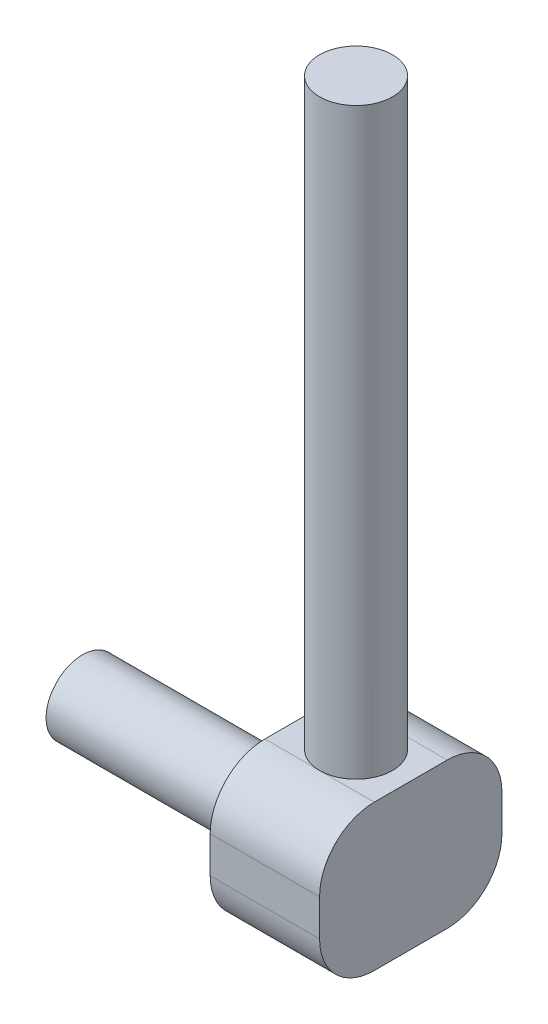
ISO-10303-21;
HEADER;
FILE_DESCRIPTION(('STEP AP214'),'2;1');
FILE_NAME('part.step','',(''),(''),'','','');
FILE_SCHEMA(('AUTOMOTIVE_DESIGN { 1 0 10303 214 1 1 1 1 }'));
ENDSEC;
DATA;
#1=APPLICATION_CONTEXT('core data for automotive mechanical design processes');
#2=APPLICATION_PROTOCOL_DEFINITION('international standard','automotive_design',2000,#1);
#3=PRODUCT_CONTEXT('',#1,'mechanical');
#4=PRODUCT('Part','Part','',(#3));
#5=PRODUCT_RELATED_PRODUCT_CATEGORY('part','',(#4));
#6=PRODUCT_DEFINITION_FORMATION('','',#4);
#7=PRODUCT_DEFINITION_CONTEXT('part definition',#1,'design');
#8=PRODUCT_DEFINITION('design','',#6,#7);
#9=PRODUCT_DEFINITION_SHAPE('','',#8);
#10=(LENGTH_UNIT() NAMED_UNIT(*) SI_UNIT(.MILLI.,.METRE.));
#11=(NAMED_UNIT(*) PLANE_ANGLE_UNIT() SI_UNIT($,.RADIAN.));
#12=(NAMED_UNIT(*) SI_UNIT($,.STERADIAN.) SOLID_ANGLE_UNIT());
#13=UNCERTAINTY_MEASURE_WITH_UNIT(LENGTH_MEASURE(1.E-05),#10,'distance_accuracy_value','');
#14=(GEOMETRIC_REPRESENTATION_CONTEXT(3) GLOBAL_UNCERTAINTY_ASSIGNED_CONTEXT((#13)) GLOBAL_UNIT_ASSIGNED_CONTEXT((#10,
#11,#12)) REPRESENTATION_CONTEXT('',''));
#15=CARTESIAN_POINT('',(0.,0.,0.));
#16=DIRECTION('',(0.,0.,1.));
#17=DIRECTION('',(1.,0.,0.));
#18=AXIS2_PLACEMENT_3D('',#15,#16,#17);
#19=CARTESIAN_POINT('',(0.,200.,0.));
#20=DIRECTION('',(0.,-1.,0.));
#21=DIRECTION('',(0.,0.,-1.));
#22=AXIS2_PLACEMENT_3D('',#19,#20,#21);
#23=CYLINDRICAL_SURFACE('',#22,10.);
#24=CARTESIAN_POINT('',(0.,40.,0.));
#25=DIRECTION('',(0.,1.,0.));
#26=DIRECTION('',(0.,0.,1.));
#27=AXIS2_PLACEMENT_3D('',#24,#25,#26);
#28=CIRCLE('',#27,10.);
#29=CARTESIAN_POINT('',(0.,40.,-10.));
#30=VERTEX_POINT('',#29);
#31=CARTESIAN_POINT('',(0.,40.,10.));
#32=VERTEX_POINT('',#31);
#33=EDGE_CURVE('E38',#30,#32,#28,.T.);
#34=ORIENTED_EDGE('',*,*,#33,.T.);
#35=EDGE_CURVE('E43',#32,#30,#28,.T.);
#36=ORIENTED_EDGE('',*,*,#35,.T.);
#37=EDGE_LOOP('',(#34,#36));
#38=FACE_BOUND('',#37,.T.);
#39=CARTESIAN_POINT('',(0.,200.,0.));
#40=DIRECTION('',(0.,1.,0.));
#41=DIRECTION('',(0.,0.,1.));
#42=AXIS2_PLACEMENT_3D('',#39,#40,#41);
#43=CIRCLE('',#42,10.);
#44=CARTESIAN_POINT('',(0.,200.,10.));
#45=VERTEX_POINT('',#44);
#46=EDGE_CURVE('E170',#45,#45,#43,.T.);
#47=ORIENTED_EDGE('',*,*,#46,.F.);
#48=EDGE_LOOP('',(#47));
#49=FACE_BOUND('',#48,.T.);
#50=ADVANCED_FACE('F35',(#38,#49),#23,.T.);
#51=CARTESIAN_POINT('',(0.,200.,0.));
#52=DIRECTION('',(0.,1.,0.));
#53=DIRECTION('',(0.,0.,1.));
#54=AXIS2_PLACEMENT_3D('',#51,#52,#53);
#55=PLANE('',#54);
#56=ORIENTED_EDGE('',*,*,#46,.T.);
#57=EDGE_LOOP('',(#56));
#58=FACE_BOUND('',#57,.T.);
#59=ADVANCED_FACE('F227',(#58),#55,.T.);
#60=CARTESIAN_POINT('',(-15.,40.,10.));
#61=DIRECTION('',(0.,1.,0.));
#62=DIRECTION('',(0.,0.,1.));
#63=AXIS2_PLACEMENT_3D('',#60,#61,#62);
#64=PLANE('',#63);
#65=ORIENTED_EDGE('',*,*,#35,.F.);
#66=DIRECTION('',(1.,0.,0.));
#67=VECTOR('',#66,1.);
#68=CARTESIAN_POINT('',(-15.,40.,10.));
#69=LINE('',#68,#67);
#70=CARTESIAN_POINT('',(15.,40.,10.));
#71=VERTEX_POINT('',#70);
#72=EDGE_CURVE('E178',#32,#71,#69,.T.);
#73=ORIENTED_EDGE('',*,*,#72,.T.);
#74=DIRECTION('',(0.,0.,1.));
#75=VECTOR('',#74,1.);
#76=CARTESIAN_POINT('',(15.,40.,10.));
#77=LINE('',#76,#75);
#78=CARTESIAN_POINT('',(15.,40.,-10.));
#79=VERTEX_POINT('',#78);
#80=EDGE_CURVE('E137',#79,#71,#77,.T.);
#81=ORIENTED_EDGE('',*,*,#80,.F.);
#82=DIRECTION('',(1.,0.,0.));
#83=VECTOR('',#82,1.);
#84=CARTESIAN_POINT('',(-15.,40.,-10.));
#85=LINE('',#84,#83);
#86=EDGE_CURVE('E182',#30,#79,#85,.T.);
#87=ORIENTED_EDGE('',*,*,#86,.F.);
#88=EDGE_LOOP('',(#65,#73,#81,#87));
#89=FACE_BOUND('',#88,.T.);
#90=ADVANCED_FACE('F191',(#89),#64,.T.);
#91=CARTESIAN_POINT('',(-15.,15.,-10.));
#92=DIRECTION('',(1.,0.,0.));
#93=DIRECTION('',(0.,0.,-1.));
#94=AXIS2_PLACEMENT_3D('',#91,#92,#93);
#95=CYLINDRICAL_SURFACE('',#94,15.);
#96=DIRECTION('',(1.,0.,0.));
#97=VECTOR('',#96,1.);
#98=CARTESIAN_POINT('',(-15.,15.0000000000001,-25.));
#99=LINE('',#98,#97);
#100=CARTESIAN_POINT('',(-15.,15.0000000000001,-25.));
#101=VERTEX_POINT('',#100);
#102=CARTESIAN_POINT('',(15.,15.0000000000001,-25.));
#103=VERTEX_POINT('',#102);
#104=EDGE_CURVE('E105',#101,#103,#99,.T.);
#105=ORIENTED_EDGE('',*,*,#104,.T.);
#106=CARTESIAN_POINT('',(15.,15.,-10.));
#107=DIRECTION('',(1.,0.,0.));
#108=DIRECTION('',(0.,0.,-1.));
#109=AXIS2_PLACEMENT_3D('',#106,#107,#108);
#110=CIRCLE('',#109,15.);
#111=CARTESIAN_POINT('',(15.,0.,-9.9999999999999));
#112=VERTEX_POINT('',#111);
#113=EDGE_CURVE('E109',#112,#103,#110,.T.);
#114=ORIENTED_EDGE('',*,*,#113,.F.);
#115=DIRECTION('',(1.,0.,0.));
#116=VECTOR('',#115,1.);
#117=CARTESIAN_POINT('',(-15.,0.,-9.9999999999999));
#118=LINE('',#117,#116);
#119=CARTESIAN_POINT('',(-15.,0.,-9.9999999999999));
#120=VERTEX_POINT('',#119);
#121=EDGE_CURVE('E168',#120,#112,#118,.T.);
#122=ORIENTED_EDGE('',*,*,#121,.F.);
#123=CARTESIAN_POINT('',(-15.,15.,-10.));
#124=DIRECTION('',(1.,0.,0.));
#125=DIRECTION('',(0.,0.,-1.));
#126=AXIS2_PLACEMENT_3D('',#123,#124,#125);
#127=CIRCLE('',#126,15.);
#128=EDGE_CURVE('E111',#120,#101,#127,.T.);
#129=ORIENTED_EDGE('',*,*,#128,.T.);
#130=EDGE_LOOP('',(#105,#114,#122,#129));
#131=FACE_BOUND('',#130,.T.);
#132=ADVANCED_FACE('F107',(#131),#95,.T.);
#133=CARTESIAN_POINT('',(-15.,15.,10.));
#134=DIRECTION('',(1.,0.,0.));
#135=DIRECTION('',(0.,0.,-1.));
#136=AXIS2_PLACEMENT_3D('',#133,#134,#135);
#137=CYLINDRICAL_SURFACE('',#136,15.);
#138=DIRECTION('',(1.,0.,0.));
#139=VECTOR('',#138,1.);
#140=CARTESIAN_POINT('',(-15.,0.,9.9999999999999));
#141=LINE('',#140,#139);
#142=CARTESIAN_POINT('',(-15.,0.,9.9999999999999));
#143=VERTEX_POINT('',#142);
#144=CARTESIAN_POINT('',(15.,0.,9.9999999999999));
#145=VERTEX_POINT('',#144);
#146=EDGE_CURVE('E171',#143,#145,#141,.T.);
#147=ORIENTED_EDGE('',*,*,#146,.T.);
#148=CARTESIAN_POINT('',(15.,15.,10.));
#149=DIRECTION('',(1.,0.,0.));
#150=DIRECTION('',(0.,0.,1.));
#151=AXIS2_PLACEMENT_3D('',#148,#149,#150);
#152=CIRCLE('',#151,15.);
#153=CARTESIAN_POINT('',(15.,15.,25.));
#154=VERTEX_POINT('',#153);
#155=EDGE_CURVE('E146',#154,#145,#152,.T.);
#156=ORIENTED_EDGE('',*,*,#155,.F.);
#157=DIRECTION('',(1.,0.,0.));
#158=VECTOR('',#157,1.);
#159=CARTESIAN_POINT('',(-15.,15.,25.));
#160=LINE('',#159,#158);
#161=CARTESIAN_POINT('',(-15.,15.,25.));
#162=VERTEX_POINT('',#161);
#163=EDGE_CURVE('E173',#162,#154,#160,.T.);
#164=ORIENTED_EDGE('',*,*,#163,.F.);
#165=CARTESIAN_POINT('',(-15.,15.,10.));
#166=DIRECTION('',(1.,0.,0.));
#167=DIRECTION('',(0.,0.,1.));
#168=AXIS2_PLACEMENT_3D('',#165,#166,#167);
#169=CIRCLE('',#168,15.);
#170=EDGE_CURVE('E163',#162,#143,#169,.T.);
#171=ORIENTED_EDGE('',*,*,#170,.T.);
#172=EDGE_LOOP('',(#147,#156,#164,#171));
#173=FACE_BOUND('',#172,.T.);
#174=ADVANCED_FACE('F211',(#173),#137,.T.);
#175=CARTESIAN_POINT('',(-15.,25.,25.));
#176=DIRECTION('',(0.,0.,1.));
#177=DIRECTION('',(0.,-1.,0.));
#178=AXIS2_PLACEMENT_3D('',#175,#176,#177);
#179=PLANE('',#178);
#180=ORIENTED_EDGE('',*,*,#163,.T.);
#181=DIRECTION('',(0.,-1.,0.));
#182=VECTOR('',#181,1.);
#183=CARTESIAN_POINT('',(15.,25.,25.));
#184=LINE('',#183,#182);
#185=CARTESIAN_POINT('',(15.,25.,25.));
#186=VERTEX_POINT('',#185);
#187=EDGE_CURVE('E143',#186,#154,#184,.T.);
#188=ORIENTED_EDGE('',*,*,#187,.F.);
#189=DIRECTION('',(1.,0.,0.));
#190=VECTOR('',#189,1.);
#191=CARTESIAN_POINT('',(-15.,25.,25.));
#192=LINE('',#191,#190);
#193=CARTESIAN_POINT('',(-15.,25.,25.));
#194=VERTEX_POINT('',#193);
#195=EDGE_CURVE('E175',#194,#186,#192,.T.);
#196=ORIENTED_EDGE('',*,*,#195,.F.);
#197=DIRECTION('',(0.,-1.,0.));
#198=VECTOR('',#197,1.);
#199=CARTESIAN_POINT('',(-15.,25.,25.));
#200=LINE('',#199,#198);
#201=EDGE_CURVE('E160',#194,#162,#200,.T.);
#202=ORIENTED_EDGE('',*,*,#201,.T.);
#203=EDGE_LOOP('',(#180,#188,#196,#202));
#204=FACE_BOUND('',#203,.T.);
#205=ADVANCED_FACE('F209',(#204),#179,.T.);
#206=CARTESIAN_POINT('',(-15.,25.,10.));
#207=DIRECTION('',(1.,0.,0.));
#208=DIRECTION('',(0.,0.,-1.));
#209=AXIS2_PLACEMENT_3D('',#206,#207,#208);
#210=CYLINDRICAL_SURFACE('',#209,15.);
#211=ORIENTED_EDGE('',*,*,#195,.T.);
#212=CARTESIAN_POINT('',(15.,25.,10.));
#213=DIRECTION('',(1.,0.,0.));
#214=DIRECTION('',(0.,0.,-1.));
#215=AXIS2_PLACEMENT_3D('',#212,#213,#214);
#216=CIRCLE('',#215,15.);
#217=EDGE_CURVE('E140',#71,#186,#216,.T.);
#218=ORIENTED_EDGE('',*,*,#217,.F.);
#219=ORIENTED_EDGE('',*,*,#72,.F.);
#220=CARTESIAN_POINT('',(-15.,40.,10.));
#221=VERTEX_POINT('',#220);
#222=EDGE_CURVE('E51',#221,#32,#69,.T.);
#223=ORIENTED_EDGE('',*,*,#222,.F.);
#224=CARTESIAN_POINT('',(-15.,25.,10.));
#225=DIRECTION('',(1.,0.,0.));
#226=DIRECTION('',(0.,0.,-1.));
#227=AXIS2_PLACEMENT_3D('',#224,#225,#226);
#228=CIRCLE('',#227,15.);
#229=EDGE_CURVE('E157',#221,#194,#228,.T.);
#230=ORIENTED_EDGE('',*,*,#229,.T.);
#231=EDGE_LOOP('',(#211,#218,#219,#223,#230));
#232=FACE_BOUND('',#231,.T.);
#233=ADVANCED_FACE('F204',(#232),#210,.T.);
#234=ORIENTED_EDGE('',*,*,#33,.F.);
#235=CARTESIAN_POINT('',(-15.,40.,-10.));
#236=VERTEX_POINT('',#235);
#237=EDGE_CURVE('E179',#236,#30,#85,.T.);
#238=ORIENTED_EDGE('',*,*,#237,.F.);
#239=DIRECTION('',(0.,0.,1.));
#240=VECTOR('',#239,1.);
#241=CARTESIAN_POINT('',(-15.,40.,10.));
#242=LINE('',#241,#240);
#243=EDGE_CURVE('E155',#236,#221,#242,.T.);
#244=ORIENTED_EDGE('',*,*,#243,.T.);
#245=ORIENTED_EDGE('',*,*,#222,.T.);
#246=EDGE_LOOP('',(#234,#238,#244,#245));
#247=FACE_BOUND('',#246,.T.);
#248=ADVANCED_FACE('F197',(#247),#64,.T.);
#249=CARTESIAN_POINT('',(-15.,25.,-10.));
#250=DIRECTION('',(1.,0.,0.));
#251=DIRECTION('',(0.,0.,-1.));
#252=AXIS2_PLACEMENT_3D('',#249,#250,#251);
#253=CYLINDRICAL_SURFACE('',#252,15.);
#254=ORIENTED_EDGE('',*,*,#237,.T.);
#255=ORIENTED_EDGE('',*,*,#86,.T.);
#256=CARTESIAN_POINT('',(15.,25.,-10.));
#257=DIRECTION('',(1.,0.,0.));
#258=DIRECTION('',(0.,0.,-1.));
#259=AXIS2_PLACEMENT_3D('',#256,#257,#258);
#260=CIRCLE('',#259,15.);
#261=CARTESIAN_POINT('',(15.,25.,-25.));
#262=VERTEX_POINT('',#261);
#263=EDGE_CURVE('E124',#262,#79,#260,.T.);
#264=ORIENTED_EDGE('',*,*,#263,.F.);
#265=DIRECTION('',(1.,0.,0.));
#266=VECTOR('',#265,1.);
#267=CARTESIAN_POINT('',(-15.,25.,-25.));
#268=LINE('',#267,#266);
#269=CARTESIAN_POINT('',(-15.,25.,-25.));
#270=VERTEX_POINT('',#269);
#271=EDGE_CURVE('E115',#270,#262,#268,.T.);
#272=ORIENTED_EDGE('',*,*,#271,.F.);
#273=CARTESIAN_POINT('',(-15.,25.,-10.));
#274=DIRECTION('',(1.,0.,0.));
#275=DIRECTION('',(0.,0.,-1.));
#276=AXIS2_PLACEMENT_3D('',#273,#274,#275);
#277=CIRCLE('',#276,15.);
#278=EDGE_CURVE('E152',#270,#236,#277,.T.);
#279=ORIENTED_EDGE('',*,*,#278,.T.);
#280=EDGE_LOOP('',(#254,#255,#264,#272,#279));
#281=FACE_BOUND('',#280,.T.);
#282=ADVANCED_FACE('F194',(#281),#253,.T.);
#283=CARTESIAN_POINT('',(-15.,25.,-25.));
#284=DIRECTION('',(0.,0.,-1.));
#285=DIRECTION('',(0.,1.,0.));
#286=AXIS2_PLACEMENT_3D('',#283,#284,#285);
#287=PLANE('',#286);
#288=ORIENTED_EDGE('',*,*,#271,.T.);
#289=DIRECTION('',(0.,1.,0.));
#290=VECTOR('',#289,1.);
#291=CARTESIAN_POINT('',(15.,25.,-25.));
#292=LINE('',#291,#290);
#293=EDGE_CURVE('E119',#103,#262,#292,.T.);
#294=ORIENTED_EDGE('',*,*,#293,.F.);
#295=ORIENTED_EDGE('',*,*,#104,.F.);
#296=DIRECTION('',(0.,1.,0.));
#297=VECTOR('',#296,1.);
#298=CARTESIAN_POINT('',(-15.,25.,-25.));
#299=LINE('',#298,#297);
#300=EDGE_CURVE('E150',#101,#270,#299,.T.);
#301=ORIENTED_EDGE('',*,*,#300,.T.);
#302=EDGE_LOOP('',(#288,#294,#295,#301));
#303=FACE_BOUND('',#302,.T.);
#304=ADVANCED_FACE('F120',(#303),#287,.T.);
#305=CARTESIAN_POINT('',(-15.,15.,-10.));
#306=DIRECTION('',(1.,0.,0.));
#307=DIRECTION('',(0.,0.,-1.));
#308=AXIS2_PLACEMENT_3D('',#305,#306,#307);
#309=PLANE('',#308);
#310=CARTESIAN_POINT('',(-15.,15.,0.));
#311=DIRECTION('',(-1.,0.,0.));
#312=DIRECTION('',(0.,0.,1.));
#313=AXIS2_PLACEMENT_3D('',#310,#311,#312);
#314=CIRCLE('',#313,10.);
#315=CARTESIAN_POINT('',(-15.,15.,10.));
#316=VERTEX_POINT('',#315);
#317=EDGE_CURVE('E11',#316,#316,#314,.T.);
#318=ORIENTED_EDGE('',*,*,#317,.F.);
#319=EDGE_LOOP('',(#318));
#320=FACE_BOUND('',#319,.T.);
#321=ORIENTED_EDGE('',*,*,#128,.F.);
#322=DIRECTION('',(0.,0.,-1.));
#323=VECTOR('',#322,1.);
#324=CARTESIAN_POINT('',(-15.,0.,9.9999999999999));
#325=LINE('',#324,#323);
#326=EDGE_CURVE('E116',#143,#120,#325,.T.);
#327=ORIENTED_EDGE('',*,*,#326,.F.);
#328=ORIENTED_EDGE('',*,*,#170,.F.);
#329=ORIENTED_EDGE('',*,*,#201,.F.);
#330=ORIENTED_EDGE('',*,*,#229,.F.);
#331=ORIENTED_EDGE('',*,*,#243,.F.);
#332=ORIENTED_EDGE('',*,*,#278,.F.);
#333=ORIENTED_EDGE('',*,*,#300,.F.);
#334=EDGE_LOOP('',(#321,#327,#328,#329,#330,#331,#332,#333));
#335=FACE_BOUND('',#334,.T.);
#336=ADVANCED_FACE('F200',(#320,#335),#309,.F.);
#337=CARTESIAN_POINT('',(15.,15.,-10.));
#338=DIRECTION('',(1.,0.,0.));
#339=DIRECTION('',(0.,0.,-1.));
#340=AXIS2_PLACEMENT_3D('',#337,#338,#339);
#341=PLANE('',#340);
#342=ORIENTED_EDGE('',*,*,#113,.T.);
#343=ORIENTED_EDGE('',*,*,#293,.T.);
#344=ORIENTED_EDGE('',*,*,#263,.T.);
#345=ORIENTED_EDGE('',*,*,#80,.T.);
#346=ORIENTED_EDGE('',*,*,#217,.T.);
#347=ORIENTED_EDGE('',*,*,#187,.T.);
#348=ORIENTED_EDGE('',*,*,#155,.T.);
#349=DIRECTION('',(0.,0.,-1.));
#350=VECTOR('',#349,1.);
#351=CARTESIAN_POINT('',(15.,0.,9.9999999999999));
#352=LINE('',#351,#350);
#353=EDGE_CURVE('E130',#145,#112,#352,.T.);
#354=ORIENTED_EDGE('',*,*,#353,.T.);
#355=EDGE_LOOP('',(#342,#343,#344,#345,#346,#347,#348,#354));
#356=FACE_BOUND('',#355,.T.);
#357=ADVANCED_FACE('F127',(#356),#341,.T.);
#358=CARTESIAN_POINT('',(0.,0.,0.));
#359=DIRECTION('',(0.,1.,0.));
#360=DIRECTION('',(0.,0.,1.));
#361=AXIS2_PLACEMENT_3D('',#358,#359,#360);
#362=PLANE('',#361);
#363=ORIENTED_EDGE('',*,*,#326,.T.);
#364=ORIENTED_EDGE('',*,*,#121,.T.);
#365=ORIENTED_EDGE('',*,*,#353,.F.);
#366=ORIENTED_EDGE('',*,*,#146,.F.);
#367=EDGE_LOOP('',(#363,#364,#365,#366));
#368=FACE_BOUND('',#367,.T.);
#369=ADVANCED_FACE('F214',(#368),#362,.F.);
#370=CARTESIAN_POINT('',(-75.,15.,0.));
#371=DIRECTION('',(1.,0.,0.));
#372=DIRECTION('',(0.,0.,-1.));
#373=AXIS2_PLACEMENT_3D('',#370,#371,#372);
#374=CYLINDRICAL_SURFACE('',#373,10.);
#375=CARTESIAN_POINT('',(-75.,15.,0.));
#376=DIRECTION('',(-1.,0.,0.));
#377=DIRECTION('',(0.,0.,1.));
#378=AXIS2_PLACEMENT_3D('',#375,#376,#377);
#379=CIRCLE('',#378,10.);
#380=CARTESIAN_POINT('',(-75.,15.,10.));
#381=VERTEX_POINT('',#380);
#382=EDGE_CURVE('E131',#381,#381,#379,.T.);
#383=ORIENTED_EDGE('',*,*,#382,.F.);
#384=EDGE_LOOP('',(#383));
#385=FACE_BOUND('',#384,.T.);
#386=ORIENTED_EDGE('',*,*,#317,.T.);
#387=EDGE_LOOP('',(#386));
#388=FACE_BOUND('',#387,.T.);
#389=ADVANCED_FACE('F216',(#385,#388),#374,.T.);
#390=CARTESIAN_POINT('',(-75.,15.,0.));
#391=DIRECTION('',(-1.,0.,0.));
#392=DIRECTION('',(0.,0.,1.));
#393=AXIS2_PLACEMENT_3D('',#390,#391,#392);
#394=PLANE('',#393);
#395=ORIENTED_EDGE('',*,*,#382,.T.);
#396=EDGE_LOOP('',(#395));
#397=FACE_BOUND('',#396,.T.);
#398=ADVANCED_FACE('F221',(#397),#394,.T.);
#399=CLOSED_SHELL('',(#50,#59,#90,#132,#174,#205,#233,#248,#282,#304,#336,#357,#369,#389,#398));
#400=MANIFOLD_SOLID_BREP('B2',#399);
#401=ADVANCED_BREP_SHAPE_REPRESENTATION('',(#18,#400),#14);
#402=SHAPE_DEFINITION_REPRESENTATION(#9,#401);
ENDSEC;
END-ISO-10303-21;
